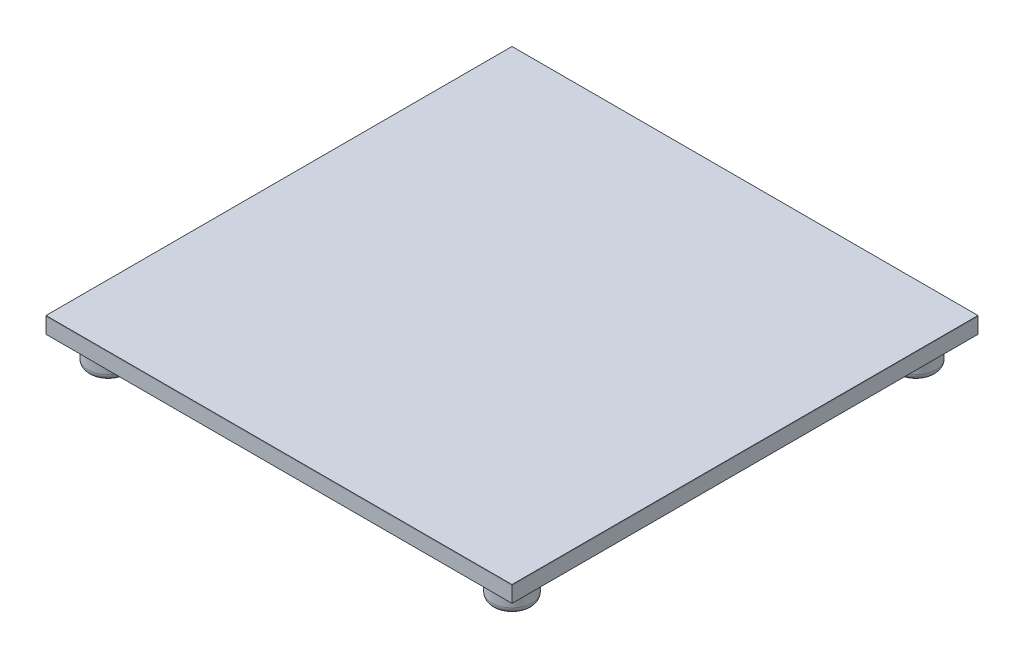
ISO-10303-21;
HEADER;
FILE_DESCRIPTION(('STEP AP214'),'2;1');
FILE_NAME('part.step','',(''),(''),'','','');
FILE_SCHEMA(('AUTOMOTIVE_DESIGN { 1 0 10303 214 1 1 1 1 }'));
ENDSEC;
DATA;
#1=APPLICATION_CONTEXT('core data for automotive mechanical design processes');
#2=APPLICATION_PROTOCOL_DEFINITION('international standard','automotive_design',2000,#1);
#3=PRODUCT_CONTEXT('',#1,'mechanical');
#4=PRODUCT('Part','Part','',(#3));
#5=PRODUCT_RELATED_PRODUCT_CATEGORY('part','',(#4));
#6=PRODUCT_DEFINITION_FORMATION('','',#4);
#7=PRODUCT_DEFINITION_CONTEXT('part definition',#1,'design');
#8=PRODUCT_DEFINITION('design','',#6,#7);
#9=PRODUCT_DEFINITION_SHAPE('','',#8);
#10=(LENGTH_UNIT() NAMED_UNIT(*) SI_UNIT(.MILLI.,.METRE.));
#11=(NAMED_UNIT(*) PLANE_ANGLE_UNIT() SI_UNIT($,.RADIAN.));
#12=(NAMED_UNIT(*) SI_UNIT($,.STERADIAN.) SOLID_ANGLE_UNIT());
#13=UNCERTAINTY_MEASURE_WITH_UNIT(LENGTH_MEASURE(1.E-05),#10,'distance_accuracy_value','');
#14=(GEOMETRIC_REPRESENTATION_CONTEXT(3) GLOBAL_UNCERTAINTY_ASSIGNED_CONTEXT((#13)) GLOBAL_UNIT_ASSIGNED_CONTEXT((#10,
#11,#12)) REPRESENTATION_CONTEXT('',''));
#15=CARTESIAN_POINT('',(0.,0.,0.));
#16=DIRECTION('',(0.,0.,1.));
#17=DIRECTION('',(1.,0.,0.));
#18=AXIS2_PLACEMENT_3D('',#15,#16,#17);
#19=CARTESIAN_POINT('',(-708.64525779769,-3.33066907387547E-13,1294.05902497017));
#20=DIRECTION('',(-1.,0.,0.));
#21=DIRECTION('',(0.,0.,-1.));
#22=AXIS2_PLACEMENT_3D('',#19,#20,#21);
#23=PLANE('',#22);
#24=DIRECTION('',(0.,0.,1.));
#25=VECTOR('',#24,1.);
#26=CARTESIAN_POINT('',(-708.64525779769,99.9999999999996,1294.05902497017));
#27=LINE('',#26,#25);
#28=CARTESIAN_POINT('',(-708.64525779769,99.9999999999996,1294.05902497017));
#29=VERTEX_POINT('',#28);
#30=CARTESIAN_POINT('',(-708.645257797688,100.,4294.05902497017));
#31=VERTEX_POINT('',#30);
#32=EDGE_CURVE('P0_E85',#29,#31,#27,.T.);
#33=ORIENTED_EDGE('',*,*,#32,.T.);
#34=DIRECTION('',(0.,1.,0.));
#35=VECTOR('',#34,1.);
#36=CARTESIAN_POINT('',(-708.645257797688,-3.33066907387547E-13,4294.05902497017));
#37=LINE('',#36,#35);
#38=CARTESIAN_POINT('',(-708.645257797688,-3.33066907387547E-13,4294.05902497017));
#39=VERTEX_POINT('',#38);
#40=EDGE_CURVE('P0_E77',#39,#31,#37,.T.);
#41=ORIENTED_EDGE('',*,*,#40,.F.);
#42=DIRECTION('',(0.,0.,1.));
#43=VECTOR('',#42,1.);
#44=CARTESIAN_POINT('',(-708.64525779769,-3.33066907387547E-13,1294.05902497017));
#45=LINE('',#44,#43);
#46=CARTESIAN_POINT('',(-708.64525779769,-3.33066907387547E-13,1294.05902497017));
#47=VERTEX_POINT('',#46);
#48=EDGE_CURVE('P0_E68',#47,#39,#45,.T.);
#49=ORIENTED_EDGE('',*,*,#48,.F.);
#50=DIRECTION('',(0.,1.,0.));
#51=VECTOR('',#50,1.);
#52=CARTESIAN_POINT('',(-708.64525779769,-3.33066907387547E-13,1294.05902497017));
#53=LINE('',#52,#51);
#54=EDGE_CURVE('P0_E34',#47,#29,#53,.T.);
#55=ORIENTED_EDGE('',*,*,#54,.T.);
#56=EDGE_LOOP('',(#33,#41,#49,#55));
#57=FACE_BOUND('',#56,.T.);
#58=ADVANCED_FACE('P0_F17',(#57),#23,.F.);
#59=CARTESIAN_POINT('',(-708.645257797688,-3.33066907387547E-13,4294.05902497017));
#60=DIRECTION('',(0.,0.,-1.));
#61=DIRECTION('',(1.,0.,0.));
#62=AXIS2_PLACEMENT_3D('',#59,#60,#61);
#63=PLANE('',#62);
#64=DIRECTION('',(-1.,0.,0.));
#65=VECTOR('',#64,1.);
#66=CARTESIAN_POINT('',(-708.645257797688,100.,4294.05902497017));
#67=LINE('',#66,#65);
#68=CARTESIAN_POINT('',(-3708.64525779769,100.,4294.05902497017));
#69=VERTEX_POINT('',#68);
#70=EDGE_CURVE('P0_E74',#31,#69,#67,.T.);
#71=ORIENTED_EDGE('',*,*,#70,.T.);
#72=DIRECTION('',(0.,1.,0.));
#73=VECTOR('',#72,1.);
#74=CARTESIAN_POINT('',(-3708.64525779769,2.22044604925031E-13,4294.05902497017));
#75=LINE('',#74,#73);
#76=CARTESIAN_POINT('',(-3708.64525779769,2.22044604925031E-13,4294.05902497017));
#77=VERTEX_POINT('',#76);
#78=EDGE_CURVE('P0_E72',#77,#69,#75,.T.);
#79=ORIENTED_EDGE('',*,*,#78,.F.);
#80=DIRECTION('',(-1.,0.,0.));
#81=VECTOR('',#80,1.);
#82=CARTESIAN_POINT('',(-708.645257797688,-3.33066907387547E-13,4294.05902497017));
#83=LINE('',#82,#81);
#84=EDGE_CURVE('P0_E60',#39,#77,#83,.T.);
#85=ORIENTED_EDGE('',*,*,#84,.F.);
#86=ORIENTED_EDGE('',*,*,#40,.T.);
#87=EDGE_LOOP('',(#71,#79,#85,#86));
#88=FACE_BOUND('',#87,.T.);
#89=ADVANCED_FACE('P0_F73',(#88),#63,.F.);
#90=CARTESIAN_POINT('',(-3708.64525779769,-2.22044604925031E-13,1294.05902497017));
#91=DIRECTION('',(-1.,0.,0.));
#92=DIRECTION('',(0.,0.,-1.));
#93=AXIS2_PLACEMENT_3D('',#90,#91,#92);
#94=PLANE('',#93);
#95=DIRECTION('',(0.,0.,1.));
#96=VECTOR('',#95,1.);
#97=CARTESIAN_POINT('',(-3708.64525779769,100.,1294.05902497017));
#98=LINE('',#97,#96);
#99=CARTESIAN_POINT('',(-3708.64525779769,100.,1294.05902497017));
#100=VERTEX_POINT('',#99);
#101=EDGE_CURVE('P0_E89',#100,#69,#98,.T.);
#102=ORIENTED_EDGE('',*,*,#101,.F.);
#103=DIRECTION('',(0.,1.,0.));
#104=VECTOR('',#103,1.);
#105=CARTESIAN_POINT('',(-3708.64525779769,-2.22044604925031E-13,1294.05902497017));
#106=LINE('',#105,#104);
#107=CARTESIAN_POINT('',(-3708.64525779769,-2.22044604925031E-13,1294.05902497017));
#108=VERTEX_POINT('',#107);
#109=EDGE_CURVE('P0_E48',#108,#100,#106,.T.);
#110=ORIENTED_EDGE('',*,*,#109,.F.);
#111=DIRECTION('',(0.,0.,1.));
#112=VECTOR('',#111,1.);
#113=CARTESIAN_POINT('',(-3708.64525779769,-2.22044604925031E-13,1294.05902497017));
#114=LINE('',#113,#112);
#115=EDGE_CURVE('P0_E67',#108,#77,#114,.T.);
#116=ORIENTED_EDGE('',*,*,#115,.T.);
#117=ORIENTED_EDGE('',*,*,#78,.T.);
#118=EDGE_LOOP('',(#102,#110,#116,#117));
#119=FACE_BOUND('',#118,.T.);
#120=ADVANCED_FACE('P0_F79',(#119),#94,.T.);
#121=CARTESIAN_POINT('',(-708.64525779769,-3.33066907387547E-13,1294.05902497017));
#122=DIRECTION('',(0.,0.,-1.));
#123=DIRECTION('',(1.,0.,0.));
#124=AXIS2_PLACEMENT_3D('',#121,#122,#123);
#125=PLANE('',#124);
#126=DIRECTION('',(-1.,0.,0.));
#127=VECTOR('',#126,1.);
#128=CARTESIAN_POINT('',(-708.64525779769,99.9999999999996,1294.05902497017));
#129=LINE('',#128,#127);
#130=EDGE_CURVE('P0_E91',#29,#100,#129,.T.);
#131=ORIENTED_EDGE('',*,*,#130,.F.);
#132=ORIENTED_EDGE('',*,*,#54,.F.);
#133=DIRECTION('',(-1.,0.,0.));
#134=VECTOR('',#133,1.);
#135=CARTESIAN_POINT('',(-708.64525779769,-3.33066907387547E-13,1294.05902497017));
#136=LINE('',#135,#134);
#137=EDGE_CURVE('P0_E80',#47,#108,#136,.T.);
#138=ORIENTED_EDGE('',*,*,#137,.T.);
#139=ORIENTED_EDGE('',*,*,#109,.T.);
#140=EDGE_LOOP('',(#131,#132,#138,#139));
#141=FACE_BOUND('',#140,.T.);
#142=ADVANCED_FACE('P0_F168',(#141),#125,.T.);
#143=CARTESIAN_POINT('',(-2579.69788937664,2.22044604925031E-13,3137.48007760175));
#144=DIRECTION('',(0.,-1.,0.));
#145=DIRECTION('',(0.,0.,1.));
#146=AXIS2_PLACEMENT_3D('',#143,#144,#145);
#147=PLANE('',#146);
#148=CARTESIAN_POINT('',(-3508.64525779769,0.,1494.05902497017));
#149=DIRECTION('',(0.,-1.,0.));
#150=DIRECTION('',(0.,0.,1.));
#151=AXIS2_PLACEMENT_3D('',#148,#149,#150);
#152=CIRCLE('',#151,128.797823222928);
#153=CARTESIAN_POINT('',(-3508.64525779769,0.,1622.8568481931));
#154=VERTEX_POINT('',#153);
#155=EDGE_CURVE('P0_E328',#154,#154,#152,.T.);
#156=ORIENTED_EDGE('',*,*,#155,.F.);
#157=EDGE_LOOP('',(#156));
#158=FACE_BOUND('',#157,.T.);
#159=CARTESIAN_POINT('',(-3508.64525779769,2.22044604925031E-13,4094.05902497017));
#160=DIRECTION('',(0.,-1.,0.));
#161=DIRECTION('',(0.,0.,1.));
#162=AXIS2_PLACEMENT_3D('',#159,#160,#161);
#163=CIRCLE('',#162,128.797823222928);
#164=CARTESIAN_POINT('',(-3508.64525779769,2.20703352919987E-13,4222.8568481931));
#165=VERTEX_POINT('',#164);
#166=EDGE_CURVE('P0_E329',#165,#165,#163,.T.);
#167=ORIENTED_EDGE('',*,*,#166,.F.);
#168=EDGE_LOOP('',(#167));
#169=FACE_BOUND('',#168,.T.);
#170=CARTESIAN_POINT('',(-908.645257797688,-3.33066907387547E-13,4094.05902497017));
#171=DIRECTION('',(0.,-1.,0.));
#172=DIRECTION('',(0.,0.,1.));
#173=AXIS2_PLACEMENT_3D('',#170,#171,#172);
#174=CIRCLE('',#173,128.797823222928);
#175=CARTESIAN_POINT('',(-908.645257797688,-3.34408159392591E-13,4222.8568481931));
#176=VERTEX_POINT('',#175);
#177=EDGE_CURVE('P0_E332',#176,#176,#174,.T.);
#178=ORIENTED_EDGE('',*,*,#177,.F.);
#179=EDGE_LOOP('',(#178));
#180=FACE_BOUND('',#179,.T.);
#181=CARTESIAN_POINT('',(-908.64525779769,3.33066907387547E-13,1494.05902497017));
#182=DIRECTION('',(0.,-1.,0.));
#183=DIRECTION('',(0.,0.,1.));
#184=AXIS2_PLACEMENT_3D('',#181,#182,#183);
#185=CIRCLE('',#184,128.797823222928);
#186=CARTESIAN_POINT('',(-908.64525779769,3.31725655382503E-13,1622.8568481931));
#187=VERTEX_POINT('',#186);
#188=EDGE_CURVE('P0_E87',#187,#187,#185,.T.);
#189=ORIENTED_EDGE('',*,*,#188,.F.);
#190=EDGE_LOOP('',(#189));
#191=FACE_BOUND('',#190,.T.);
#192=ORIENTED_EDGE('',*,*,#48,.T.);
#193=ORIENTED_EDGE('',*,*,#84,.T.);
#194=ORIENTED_EDGE('',*,*,#115,.F.);
#195=ORIENTED_EDGE('',*,*,#137,.F.);
#196=EDGE_LOOP('',(#192,#193,#194,#195));
#197=FACE_BOUND('',#196,.T.);
#198=ADVANCED_FACE('P0_F64',(#158,#169,#180,#191,#197),#147,.T.);
#199=CARTESIAN_POINT('',(-2579.69788937664,100.,3137.48007760175));
#200=DIRECTION('',(0.,-1.,0.));
#201=DIRECTION('',(0.,0.,1.));
#202=AXIS2_PLACEMENT_3D('',#199,#200,#201);
#203=PLANE('',#202);
#204=ORIENTED_EDGE('',*,*,#32,.F.);
#205=ORIENTED_EDGE('',*,*,#130,.T.);
#206=ORIENTED_EDGE('',*,*,#101,.T.);
#207=ORIENTED_EDGE('',*,*,#70,.F.);
#208=EDGE_LOOP('',(#204,#205,#206,#207));
#209=FACE_BOUND('',#208,.T.);
#210=ADVANCED_FACE('P0_F161',(#209),#203,.F.);
#211=CARTESIAN_POINT('',(-908.64525779769,-174.,1494.05902497017));
#212=DIRECTION('',(0.,1.,0.));
#213=DIRECTION('',(0.,0.,-1.));
#214=AXIS2_PLACEMENT_3D('',#211,#212,#213);
#215=CYLINDRICAL_SURFACE('',#214,128.797823222928);
#216=CARTESIAN_POINT('',(-908.64525779769,-134.,1494.05902497017));
#217=DIRECTION('',(0.,-1.,0.));
#218=DIRECTION('',(0.,0.,1.));
#219=AXIS2_PLACEMENT_3D('',#216,#217,#218);
#220=CIRCLE('',#219,128.797823222928);
#221=CARTESIAN_POINT('',(-908.64525779769,-134.,1622.8568481931));
#222=VERTEX_POINT('',#221);
#223=EDGE_CURVE('P0_E106',#222,#222,#220,.F.);
#224=ORIENTED_EDGE('',*,*,#223,.T.);
#225=EDGE_LOOP('',(#224));
#226=FACE_BOUND('',#225,.T.);
#227=ORIENTED_EDGE('',*,*,#188,.T.);
#228=EDGE_LOOP('',(#227));
#229=FACE_BOUND('',#228,.T.);
#230=ADVANCED_FACE('P0_F152',(#226,#229),#215,.T.);
#231=CARTESIAN_POINT('',(-908.64525779769,-174.,1494.05902497017));
#232=DIRECTION('',(0.,-1.,0.));
#233=DIRECTION('',(0.,0.,1.));
#234=AXIS2_PLACEMENT_3D('',#231,#232,#233);
#235=PLANE('',#234);
#236=CARTESIAN_POINT('',(-908.64525779769,-174.,1494.05902497017));
#237=DIRECTION('',(0.,-1.,0.));
#238=DIRECTION('',(0.,0.,1.));
#239=AXIS2_PLACEMENT_3D('',#236,#237,#238);
#240=CIRCLE('',#239,88.7978232229279);
#241=CARTESIAN_POINT('',(-908.64525779769,-174.,1582.8568481931));
#242=VERTEX_POINT('',#241);
#243=EDGE_CURVE('P0_E103',#242,#242,#240,.T.);
#244=ORIENTED_EDGE('',*,*,#243,.T.);
#245=EDGE_LOOP('',(#244));
#246=FACE_BOUND('',#245,.T.);
#247=ADVANCED_FACE('P0_F149',(#246),#235,.T.);
#248=CARTESIAN_POINT('',(-908.645257797688,-174.,4094.05902497017));
#249=DIRECTION('',(0.,1.,0.));
#250=DIRECTION('',(0.,0.,-1.));
#251=AXIS2_PLACEMENT_3D('',#248,#249,#250);
#252=CYLINDRICAL_SURFACE('',#251,128.797823222928);
#253=CARTESIAN_POINT('',(-908.645257797688,-134.,4094.05902497017));
#254=DIRECTION('',(0.,-1.,0.));
#255=DIRECTION('',(0.,0.,1.));
#256=AXIS2_PLACEMENT_3D('',#253,#254,#255);
#257=CIRCLE('',#256,128.797823222928);
#258=CARTESIAN_POINT('',(-908.645257797688,-134.,4222.8568481931));
#259=VERTEX_POINT('',#258);
#260=EDGE_CURVE('P0_E112',#259,#259,#257,.F.);
#261=ORIENTED_EDGE('',*,*,#260,.T.);
#262=EDGE_LOOP('',(#261));
#263=FACE_BOUND('',#262,.T.);
#264=ORIENTED_EDGE('',*,*,#177,.T.);
#265=EDGE_LOOP('',(#264));
#266=FACE_BOUND('',#265,.T.);
#267=ADVANCED_FACE('P0_F151',(#263,#266),#252,.T.);
#268=CARTESIAN_POINT('',(-908.645257797688,-174.,4094.05902497017));
#269=DIRECTION('',(0.,-1.,0.));
#270=DIRECTION('',(0.,0.,1.));
#271=AXIS2_PLACEMENT_3D('',#268,#269,#270);
#272=PLANE('',#271);
#273=CARTESIAN_POINT('',(-908.645257797688,-174.,4094.05902497017));
#274=DIRECTION('',(0.,-1.,0.));
#275=DIRECTION('',(0.,0.,1.));
#276=AXIS2_PLACEMENT_3D('',#273,#274,#275);
#277=CIRCLE('',#276,88.7978232229279);
#278=CARTESIAN_POINT('',(-908.645257797688,-174.,4182.8568481931));
#279=VERTEX_POINT('',#278);
#280=EDGE_CURVE('P0_E109',#279,#279,#277,.T.);
#281=ORIENTED_EDGE('',*,*,#280,.T.);
#282=EDGE_LOOP('',(#281));
#283=FACE_BOUND('',#282,.T.);
#284=ADVANCED_FACE('P0_F158',(#283),#272,.T.);
#285=CARTESIAN_POINT('',(-3508.64525779769,-174.,4094.05902497017));
#286=DIRECTION('',(0.,1.,0.));
#287=DIRECTION('',(0.,0.,-1.));
#288=AXIS2_PLACEMENT_3D('',#285,#286,#287);
#289=CYLINDRICAL_SURFACE('',#288,128.797823222928);
#290=CARTESIAN_POINT('',(-3508.64525779769,-134.,4094.05902497017));
#291=DIRECTION('',(0.,-1.,0.));
#292=DIRECTION('',(0.,0.,1.));
#293=AXIS2_PLACEMENT_3D('',#290,#291,#292);
#294=CIRCLE('',#293,128.797823222928);
#295=CARTESIAN_POINT('',(-3508.64525779769,-134.,4222.8568481931));
#296=VERTEX_POINT('',#295);
#297=EDGE_CURVE('P0_E100',#296,#296,#294,.F.);
#298=ORIENTED_EDGE('',*,*,#297,.T.);
#299=EDGE_LOOP('',(#298));
#300=FACE_BOUND('',#299,.T.);
#301=ORIENTED_EDGE('',*,*,#166,.T.);
#302=EDGE_LOOP('',(#301));
#303=FACE_BOUND('',#302,.T.);
#304=ADVANCED_FACE('P0_F219',(#300,#303),#289,.T.);
#305=CARTESIAN_POINT('',(-3508.64525779769,-174.,4094.05902497017));
#306=DIRECTION('',(0.,-1.,0.));
#307=DIRECTION('',(0.,0.,1.));
#308=AXIS2_PLACEMENT_3D('',#305,#306,#307);
#309=PLANE('',#308);
#310=CARTESIAN_POINT('',(-3508.64525779769,-174.,4094.05902497017));
#311=DIRECTION('',(0.,-1.,0.));
#312=DIRECTION('',(0.,0.,1.));
#313=AXIS2_PLACEMENT_3D('',#310,#311,#312);
#314=CIRCLE('',#313,88.7978232229282);
#315=CARTESIAN_POINT('',(-3508.64525779769,-174.,4182.8568481931));
#316=VERTEX_POINT('',#315);
#317=EDGE_CURVE('P0_E97',#316,#316,#314,.T.);
#318=ORIENTED_EDGE('',*,*,#317,.T.);
#319=EDGE_LOOP('',(#318));
#320=FACE_BOUND('',#319,.T.);
#321=ADVANCED_FACE('P0_F228',(#320),#309,.T.);
#322=CARTESIAN_POINT('',(-3508.64525779769,-174.,1494.05902497017));
#323=DIRECTION('',(0.,1.,0.));
#324=DIRECTION('',(0.,0.,-1.));
#325=AXIS2_PLACEMENT_3D('',#322,#323,#324);
#326=CYLINDRICAL_SURFACE('',#325,128.797823222928);
#327=CARTESIAN_POINT('',(-3508.64525779769,-134.,1494.05902497017));
#328=DIRECTION('',(0.,-1.,0.));
#329=DIRECTION('',(0.,0.,1.));
#330=AXIS2_PLACEMENT_3D('',#327,#328,#329);
#331=CIRCLE('',#330,128.797823222928);
#332=CARTESIAN_POINT('',(-3508.64525779769,-134.,1622.8568481931));
#333=VERTEX_POINT('',#332);
#334=EDGE_CURVE('P0_E11',#333,#333,#331,.F.);
#335=ORIENTED_EDGE('',*,*,#334,.T.);
#336=EDGE_LOOP('',(#335));
#337=FACE_BOUND('',#336,.T.);
#338=ORIENTED_EDGE('',*,*,#155,.T.);
#339=EDGE_LOOP('',(#338));
#340=FACE_BOUND('',#339,.T.);
#341=ADVANCED_FACE('P0_F238',(#337,#340),#326,.T.);
#342=CARTESIAN_POINT('',(-3508.64525779769,-174.,1494.05902497017));
#343=DIRECTION('',(0.,-1.,0.));
#344=DIRECTION('',(0.,0.,1.));
#345=AXIS2_PLACEMENT_3D('',#342,#343,#344);
#346=PLANE('',#345);
#347=CARTESIAN_POINT('',(-3508.64525779769,-174.,1494.05902497017));
#348=DIRECTION('',(0.,-1.,0.));
#349=DIRECTION('',(0.,0.,1.));
#350=AXIS2_PLACEMENT_3D('',#347,#348,#349);
#351=CIRCLE('',#350,88.7978232229279);
#352=CARTESIAN_POINT('',(-3508.64525779769,-174.,1582.8568481931));
#353=VERTEX_POINT('',#352);
#354=EDGE_CURVE('P0_E26',#353,#353,#351,.T.);
#355=ORIENTED_EDGE('',*,*,#354,.T.);
#356=EDGE_LOOP('',(#355));
#357=FACE_BOUND('',#356,.T.);
#358=ADVANCED_FACE('P0_F117',(#357),#346,.T.);
#359=CARTESIAN_POINT('',(-3508.64525779769,-134.,4094.05902497017));
#360=DIRECTION('',(0.,-1.,0.));
#361=DIRECTION('',(0.,0.,1.));
#362=AXIS2_PLACEMENT_3D('',#359,#360,#361);
#363=TOROIDAL_SURFACE('',#362,88.7978232229282,40.);
#364=ORIENTED_EDGE('',*,*,#297,.F.);
#365=EDGE_LOOP('',(#364));
#366=FACE_BOUND('',#365,.T.);
#367=ORIENTED_EDGE('',*,*,#317,.F.);
#368=EDGE_LOOP('',(#367));
#369=FACE_BOUND('',#368,.T.);
#370=ADVANCED_FACE('P0_F137',(#366,#369),#363,.T.);
#371=CARTESIAN_POINT('',(-908.64525779769,-134.,1494.05902497017));
#372=DIRECTION('',(0.,-1.,0.));
#373=DIRECTION('',(0.,0.,1.));
#374=AXIS2_PLACEMENT_3D('',#371,#372,#373);
#375=TOROIDAL_SURFACE('',#374,88.7978232229279,40.);
#376=ORIENTED_EDGE('',*,*,#223,.F.);
#377=EDGE_LOOP('',(#376));
#378=FACE_BOUND('',#377,.T.);
#379=ORIENTED_EDGE('',*,*,#243,.F.);
#380=EDGE_LOOP('',(#379));
#381=FACE_BOUND('',#380,.T.);
#382=ADVANCED_FACE('P0_F126',(#378,#381),#375,.T.);
#383=CARTESIAN_POINT('',(-908.645257797688,-134.,4094.05902497017));
#384=DIRECTION('',(0.,-1.,0.));
#385=DIRECTION('',(0.,0.,1.));
#386=AXIS2_PLACEMENT_3D('',#383,#384,#385);
#387=TOROIDAL_SURFACE('',#386,88.7978232229279,40.);
#388=ORIENTED_EDGE('',*,*,#260,.F.);
#389=EDGE_LOOP('',(#388));
#390=FACE_BOUND('',#389,.T.);
#391=ORIENTED_EDGE('',*,*,#280,.F.);
#392=EDGE_LOOP('',(#391));
#393=FACE_BOUND('',#392,.T.);
#394=ADVANCED_FACE('P0_F120',(#390,#393),#387,.T.);
#395=CARTESIAN_POINT('',(-3508.64525779769,-134.,1494.05902497017));
#396=DIRECTION('',(0.,-1.,0.));
#397=DIRECTION('',(0.,0.,1.));
#398=AXIS2_PLACEMENT_3D('',#395,#396,#397);
#399=TOROIDAL_SURFACE('',#398,88.7978232229279,40.);
#400=ORIENTED_EDGE('',*,*,#334,.F.);
#401=EDGE_LOOP('',(#400));
#402=FACE_BOUND('',#401,.T.);
#403=ORIENTED_EDGE('',*,*,#354,.F.);
#404=EDGE_LOOP('',(#403));
#405=FACE_BOUND('',#404,.T.);
#406=ADVANCED_FACE('P0_F19',(#402,#405),#399,.T.);
#407=CLOSED_SHELL('',(#58,#89,#120,#142,#198,#210,#230,#247,#267,#284,#304,#321,#341,#358,#370,
#382,#394,#406));
#408=MANIFOLD_SOLID_BREP('P0_B1',#407);
#409=CARTESIAN_POINT('',(-708.645257797689,105.000000000003,1294.05902497018));
#410=DIRECTION('',(-1.,0.,0.));
#411=DIRECTION('',(0.,0.,1.));
#412=AXIS2_PLACEMENT_3D('',#409,#410,#411);
#413=PLANE('',#412);
#414=DIRECTION('',(0.,0.,-1.));
#415=VECTOR('',#414,1.);
#416=CARTESIAN_POINT('',(-708.645257797689,100.000000000003,1294.05902497018));
#417=LINE('',#416,#415);
#418=CARTESIAN_POINT('',(-708.645257797688,100.000000000003,4294.05902497018));
#419=VERTEX_POINT('',#418);
#420=CARTESIAN_POINT('',(-708.645257797689,100.000000000003,1294.05902497018));
#421=VERTEX_POINT('',#420);
#422=EDGE_CURVE('P1_E84',#419,#421,#417,.T.);
#423=ORIENTED_EDGE('',*,*,#422,.T.);
#424=DIRECTION('',(0.,-1.,0.));
#425=VECTOR('',#424,1.);
#426=CARTESIAN_POINT('',(-708.645257797689,105.000000000003,1294.05902497018));
#427=LINE('',#426,#425);
#428=CARTESIAN_POINT('',(-708.645257797689,105.000000000003,1294.05902497018));
#429=VERTEX_POINT('',#428);
#430=EDGE_CURVE('P1_E11',#429,#421,#427,.T.);
#431=ORIENTED_EDGE('',*,*,#430,.F.);
#432=DIRECTION('',(0.,0.,-1.));
#433=VECTOR('',#432,1.);
#434=CARTESIAN_POINT('',(-708.645257797689,105.000000000003,1294.05902497018));
#435=LINE('',#434,#433);
#436=CARTESIAN_POINT('',(-708.645257797688,105.000000000004,4294.05902497018));
#437=VERTEX_POINT('',#436);
#438=EDGE_CURVE('P1_E68',#437,#429,#435,.T.);
#439=ORIENTED_EDGE('',*,*,#438,.F.);
#440=DIRECTION('',(0.,-1.,0.));
#441=VECTOR('',#440,1.);
#442=CARTESIAN_POINT('',(-708.645257797688,105.000000000004,4294.05902497018));
#443=LINE('',#442,#441);
#444=EDGE_CURVE('P1_E80',#437,#419,#443,.T.);
#445=ORIENTED_EDGE('',*,*,#444,.T.);
#446=EDGE_LOOP('',(#423,#431,#439,#445));
#447=FACE_BOUND('',#446,.T.);
#448=ADVANCED_FACE('P1_F17',(#447),#413,.F.);
#449=CARTESIAN_POINT('',(-3708.64525779769,105.000000000004,1294.05902497018));
#450=DIRECTION('',(0.,0.,1.));
#451=DIRECTION('',(1.,0.,0.));
#452=AXIS2_PLACEMENT_3D('',#449,#450,#451);
#453=PLANE('',#452);
#454=DIRECTION('',(-1.,0.,0.));
#455=VECTOR('',#454,1.);
#456=CARTESIAN_POINT('',(-3708.64525779769,100.000000000004,1294.05902497018));
#457=LINE('',#456,#455);
#458=CARTESIAN_POINT('',(-3708.64525779769,100.000000000004,1294.05902497018));
#459=VERTEX_POINT('',#458);
#460=EDGE_CURVE('P1_E73',#421,#459,#457,.T.);
#461=ORIENTED_EDGE('',*,*,#460,.T.);
#462=DIRECTION('',(0.,-1.,0.));
#463=VECTOR('',#462,1.);
#464=CARTESIAN_POINT('',(-3708.64525779769,105.000000000004,1294.05902497018));
#465=LINE('',#464,#463);
#466=CARTESIAN_POINT('',(-3708.64525779769,105.000000000004,1294.05902497018));
#467=VERTEX_POINT('',#466);
#468=EDGE_CURVE('P1_E25',#467,#459,#465,.T.);
#469=ORIENTED_EDGE('',*,*,#468,.F.);
#470=DIRECTION('',(-1.,0.,0.));
#471=VECTOR('',#470,1.);
#472=CARTESIAN_POINT('',(-3708.64525779769,105.000000000004,1294.05902497018));
#473=LINE('',#472,#471);
#474=EDGE_CURVE('P1_E63',#429,#467,#473,.T.);
#475=ORIENTED_EDGE('',*,*,#474,.F.);
#476=ORIENTED_EDGE('',*,*,#430,.T.);
#477=EDGE_LOOP('',(#461,#469,#475,#476));
#478=FACE_BOUND('',#477,.T.);
#479=ADVANCED_FACE('P1_F72',(#478),#453,.F.);
#480=CARTESIAN_POINT('',(-3708.64525779769,105.000000000004,1294.05902497018));
#481=DIRECTION('',(1.,0.,0.));
#482=DIRECTION('',(0.,0.,-1.));
#483=AXIS2_PLACEMENT_3D('',#480,#481,#482);
#484=PLANE('',#483);
#485=DIRECTION('',(0.,0.,1.));
#486=VECTOR('',#485,1.);
#487=CARTESIAN_POINT('',(-3708.64525779769,100.000000000004,1294.05902497018));
#488=LINE('',#487,#486);
#489=CARTESIAN_POINT('',(-3708.64525779769,100.000000000004,4294.05902497018));
#490=VERTEX_POINT('',#489);
#491=EDGE_CURVE('P1_E50',#459,#490,#488,.T.);
#492=ORIENTED_EDGE('',*,*,#491,.T.);
#493=DIRECTION('',(0.,-1.,0.));
#494=VECTOR('',#493,1.);
#495=CARTESIAN_POINT('',(-3708.64525779769,105.000000000004,4294.05902497018));
#496=LINE('',#495,#494);
#497=CARTESIAN_POINT('',(-3708.64525779769,105.000000000004,4294.05902497018));
#498=VERTEX_POINT('',#497);
#499=EDGE_CURVE('P1_E74',#498,#490,#496,.T.);
#500=ORIENTED_EDGE('',*,*,#499,.F.);
#501=DIRECTION('',(0.,0.,1.));
#502=VECTOR('',#501,1.);
#503=CARTESIAN_POINT('',(-3708.64525779769,105.000000000004,1294.05902497018));
#504=LINE('',#503,#502);
#505=EDGE_CURVE('P1_E66',#467,#498,#504,.T.);
#506=ORIENTED_EDGE('',*,*,#505,.F.);
#507=ORIENTED_EDGE('',*,*,#468,.T.);
#508=EDGE_LOOP('',(#492,#500,#506,#507));
#509=FACE_BOUND('',#508,.T.);
#510=ADVANCED_FACE('P1_F75',(#509),#484,.F.);
#511=CARTESIAN_POINT('',(-3708.64525779769,105.000000000004,4294.05902497018));
#512=DIRECTION('',(0.,0.,-1.));
#513=DIRECTION('',(-1.,0.,0.));
#514=AXIS2_PLACEMENT_3D('',#511,#512,#513);
#515=PLANE('',#514);
#516=DIRECTION('',(1.,0.,0.));
#517=VECTOR('',#516,1.);
#518=CARTESIAN_POINT('',(-3708.64525779769,100.000000000004,4294.05902497018));
#519=LINE('',#518,#517);
#520=EDGE_CURVE('P1_E56',#490,#419,#519,.T.);
#521=ORIENTED_EDGE('',*,*,#520,.T.);
#522=ORIENTED_EDGE('',*,*,#444,.F.);
#523=DIRECTION('',(1.,0.,0.));
#524=VECTOR('',#523,1.);
#525=CARTESIAN_POINT('',(-3708.64525779769,105.000000000004,4294.05902497018));
#526=LINE('',#525,#524);
#527=EDGE_CURVE('P1_E33',#498,#437,#526,.T.);
#528=ORIENTED_EDGE('',*,*,#527,.F.);
#529=ORIENTED_EDGE('',*,*,#499,.T.);
#530=EDGE_LOOP('',(#521,#522,#528,#529));
#531=FACE_BOUND('',#530,.T.);
#532=ADVANCED_FACE('P1_F91',(#531),#515,.F.);
#533=CARTESIAN_POINT('',(-2208.64525779769,105.000000000004,2794.05902497018));
#534=DIRECTION('',(0.,1.,0.));
#535=DIRECTION('',(0.,0.,1.));
#536=AXIS2_PLACEMENT_3D('',#533,#534,#535);
#537=PLANE('',#536);
#538=ORIENTED_EDGE('',*,*,#438,.T.);
#539=ORIENTED_EDGE('',*,*,#474,.T.);
#540=ORIENTED_EDGE('',*,*,#505,.T.);
#541=ORIENTED_EDGE('',*,*,#527,.T.);
#542=EDGE_LOOP('',(#538,#539,#540,#541));
#543=FACE_BOUND('',#542,.T.);
#544=ADVANCED_FACE('P1_F64',(#543),#537,.T.);
#545=CARTESIAN_POINT('',(-2208.64525779769,100.000000000004,2794.05902497018));
#546=DIRECTION('',(0.,1.,0.));
#547=DIRECTION('',(0.,0.,1.));
#548=AXIS2_PLACEMENT_3D('',#545,#546,#547);
#549=PLANE('',#548);
#550=ORIENTED_EDGE('',*,*,#422,.F.);
#551=ORIENTED_EDGE('',*,*,#520,.F.);
#552=ORIENTED_EDGE('',*,*,#491,.F.);
#553=ORIENTED_EDGE('',*,*,#460,.F.);
#554=EDGE_LOOP('',(#550,#551,#552,#553));
#555=FACE_BOUND('',#554,.T.);
#556=ADVANCED_FACE('P1_F94',(#555),#549,.F.);
#557=CLOSED_SHELL('',(#448,#479,#510,#532,#544,#556));
#558=MANIFOLD_SOLID_BREP('P1_B1',#557);
#559=ADVANCED_BREP_SHAPE_REPRESENTATION('',(#18,#408,#558),#14);
#560=SHAPE_DEFINITION_REPRESENTATION(#9,#559);
ENDSEC;
END-ISO-10303-21;
